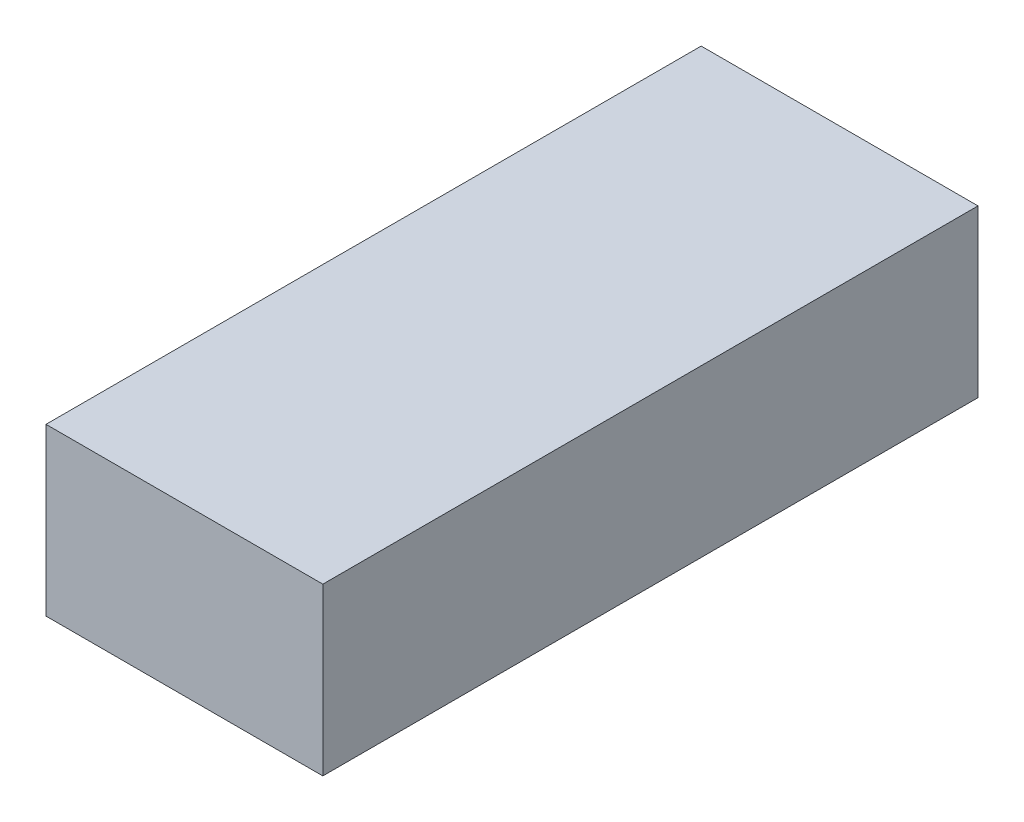
ISO-10303-21;
HEADER;
FILE_DESCRIPTION(('STEP AP214'),'2;1');
FILE_NAME('part.step','',(''),(''),'','','');
FILE_SCHEMA(('AUTOMOTIVE_DESIGN { 1 0 10303 214 1 1 1 1 }'));
ENDSEC;
DATA;
#1=APPLICATION_CONTEXT('core data for automotive mechanical design processes');
#2=APPLICATION_PROTOCOL_DEFINITION('international standard','automotive_design',2000,#1);
#3=PRODUCT_CONTEXT('',#1,'mechanical');
#4=PRODUCT('Part','Part','',(#3));
#5=PRODUCT_RELATED_PRODUCT_CATEGORY('part','',(#4));
#6=PRODUCT_DEFINITION_FORMATION('','',#4);
#7=PRODUCT_DEFINITION_CONTEXT('part definition',#1,'design');
#8=PRODUCT_DEFINITION('design','',#6,#7);
#9=PRODUCT_DEFINITION_SHAPE('','',#8);
#10=(LENGTH_UNIT() NAMED_UNIT(*) SI_UNIT(.MILLI.,.METRE.));
#11=(NAMED_UNIT(*) PLANE_ANGLE_UNIT() SI_UNIT($,.RADIAN.));
#12=(NAMED_UNIT(*) SI_UNIT($,.STERADIAN.) SOLID_ANGLE_UNIT());
#13=UNCERTAINTY_MEASURE_WITH_UNIT(LENGTH_MEASURE(1.E-05),#10,'distance_accuracy_value','');
#14=(GEOMETRIC_REPRESENTATION_CONTEXT(3) GLOBAL_UNCERTAINTY_ASSIGNED_CONTEXT((#13)) GLOBAL_UNIT_ASSIGNED_CONTEXT((#10,
#11,#12)) REPRESENTATION_CONTEXT('',''));
#15=CARTESIAN_POINT('',(0.,0.,0.));
#16=DIRECTION('',(0.,0.,1.));
#17=DIRECTION('',(1.,0.,0.));
#18=AXIS2_PLACEMENT_3D('',#15,#16,#17);
#19=CARTESIAN_POINT('',(15.,18.,-35.5));
#20=DIRECTION('',(-1.,0.,0.));
#21=DIRECTION('',(0.,0.,1.));
#22=AXIS2_PLACEMENT_3D('',#19,#20,#21);
#23=PLANE('',#22);
#24=DIRECTION('',(0.,0.,-1.));
#25=VECTOR('',#24,1.);
#26=CARTESIAN_POINT('',(15.,0.,-35.5));
#27=LINE('',#26,#25);
#28=CARTESIAN_POINT('',(15.,0.,35.5));
#29=VERTEX_POINT('',#28);
#30=CARTESIAN_POINT('',(15.,0.,-35.5));
#31=VERTEX_POINT('',#30);
#32=EDGE_CURVE('E106',#29,#31,#27,.T.);
#33=ORIENTED_EDGE('',*,*,#32,.T.);
#34=DIRECTION('',(0.,-1.,0.));
#35=VECTOR('',#34,1.);
#36=CARTESIAN_POINT('',(15.,18.,-35.5));
#37=LINE('',#36,#35);
#38=CARTESIAN_POINT('',(15.,18.,-35.5));
#39=VERTEX_POINT('',#38);
#40=EDGE_CURVE('E11',#39,#31,#37,.T.);
#41=ORIENTED_EDGE('',*,*,#40,.F.);
#42=DIRECTION('',(0.,0.,-1.));
#43=VECTOR('',#42,1.);
#44=CARTESIAN_POINT('',(15.,18.,-35.5));
#45=LINE('',#44,#43);
#46=CARTESIAN_POINT('',(15.,18.,35.5));
#47=VERTEX_POINT('',#46);
#48=EDGE_CURVE('E94',#47,#39,#45,.T.);
#49=ORIENTED_EDGE('',*,*,#48,.F.);
#50=DIRECTION('',(0.,-1.,0.));
#51=VECTOR('',#50,1.);
#52=CARTESIAN_POINT('',(15.,18.,35.5));
#53=LINE('',#52,#51);
#54=EDGE_CURVE('E105',#47,#29,#53,.T.);
#55=ORIENTED_EDGE('',*,*,#54,.T.);
#56=EDGE_LOOP('',(#33,#41,#49,#55));
#57=FACE_BOUND('',#56,.T.);
#58=ADVANCED_FACE('F43',(#57),#23,.F.);
#59=CARTESIAN_POINT('',(-15.,18.,-35.5));
#60=DIRECTION('',(0.,0.,1.));
#61=DIRECTION('',(1.,0.,0.));
#62=AXIS2_PLACEMENT_3D('',#59,#60,#61);
#63=PLANE('',#62);
#64=DIRECTION('',(-1.,0.,0.));
#65=VECTOR('',#64,1.);
#66=CARTESIAN_POINT('',(-15.,0.,-35.5));
#67=LINE('',#66,#65);
#68=CARTESIAN_POINT('',(-15.,0.,-35.5));
#69=VERTEX_POINT('',#68);
#70=EDGE_CURVE('E98',#31,#69,#67,.T.);
#71=ORIENTED_EDGE('',*,*,#70,.T.);
#72=DIRECTION('',(0.,-1.,0.));
#73=VECTOR('',#72,1.);
#74=CARTESIAN_POINT('',(-15.,18.,-35.5));
#75=LINE('',#74,#73);
#76=CARTESIAN_POINT('',(-15.,18.,-35.5));
#77=VERTEX_POINT('',#76);
#78=EDGE_CURVE('E51',#77,#69,#75,.T.);
#79=ORIENTED_EDGE('',*,*,#78,.F.);
#80=DIRECTION('',(-1.,0.,0.));
#81=VECTOR('',#80,1.);
#82=CARTESIAN_POINT('',(-15.,18.,-35.5));
#83=LINE('',#82,#81);
#84=EDGE_CURVE('E90',#39,#77,#83,.T.);
#85=ORIENTED_EDGE('',*,*,#84,.F.);
#86=ORIENTED_EDGE('',*,*,#40,.T.);
#87=EDGE_LOOP('',(#71,#79,#85,#86));
#88=FACE_BOUND('',#87,.T.);
#89=ADVANCED_FACE('F100',(#88),#63,.F.);
#90=CARTESIAN_POINT('',(-15.,18.,-35.5));
#91=DIRECTION('',(1.,0.,0.));
#92=DIRECTION('',(0.,0.,-1.));
#93=AXIS2_PLACEMENT_3D('',#90,#91,#92);
#94=PLANE('',#93);
#95=DIRECTION('',(0.,0.,1.));
#96=VECTOR('',#95,1.);
#97=CARTESIAN_POINT('',(-15.,0.,-35.5));
#98=LINE('',#97,#96);
#99=CARTESIAN_POINT('',(-15.,0.,35.5));
#100=VERTEX_POINT('',#99);
#101=EDGE_CURVE('E77',#69,#100,#98,.T.);
#102=ORIENTED_EDGE('',*,*,#101,.T.);
#103=DIRECTION('',(0.,-1.,0.));
#104=VECTOR('',#103,1.);
#105=CARTESIAN_POINT('',(-15.,18.,35.5));
#106=LINE('',#105,#104);
#107=CARTESIAN_POINT('',(-15.,18.,35.5));
#108=VERTEX_POINT('',#107);
#109=EDGE_CURVE('E97',#108,#100,#106,.T.);
#110=ORIENTED_EDGE('',*,*,#109,.F.);
#111=DIRECTION('',(0.,0.,1.));
#112=VECTOR('',#111,1.);
#113=CARTESIAN_POINT('',(-15.,18.,-35.5));
#114=LINE('',#113,#112);
#115=EDGE_CURVE('E95',#77,#108,#114,.T.);
#116=ORIENTED_EDGE('',*,*,#115,.F.);
#117=ORIENTED_EDGE('',*,*,#78,.T.);
#118=EDGE_LOOP('',(#102,#110,#116,#117));
#119=FACE_BOUND('',#118,.T.);
#120=ADVANCED_FACE('F99',(#119),#94,.F.);
#121=CARTESIAN_POINT('',(-15.,18.,35.5));
#122=DIRECTION('',(0.,0.,-1.));
#123=DIRECTION('',(-1.,0.,0.));
#124=AXIS2_PLACEMENT_3D('',#121,#122,#123);
#125=PLANE('',#124);
#126=DIRECTION('',(1.,0.,0.));
#127=VECTOR('',#126,1.);
#128=CARTESIAN_POINT('',(-15.,0.,35.5));
#129=LINE('',#128,#127);
#130=EDGE_CURVE('E85',#100,#29,#129,.T.);
#131=ORIENTED_EDGE('',*,*,#130,.T.);
#132=ORIENTED_EDGE('',*,*,#54,.F.);
#133=DIRECTION('',(1.,0.,0.));
#134=VECTOR('',#133,1.);
#135=CARTESIAN_POINT('',(-15.,18.,35.5));
#136=LINE('',#135,#134);
#137=EDGE_CURVE('E56',#108,#47,#136,.T.);
#138=ORIENTED_EDGE('',*,*,#137,.F.);
#139=ORIENTED_EDGE('',*,*,#109,.T.);
#140=EDGE_LOOP('',(#131,#132,#138,#139));
#141=FACE_BOUND('',#140,.T.);
#142=ADVANCED_FACE('F114',(#141),#125,.F.);
#143=CARTESIAN_POINT('',(0.,18.,0.));
#144=DIRECTION('',(0.,1.,0.));
#145=DIRECTION('',(0.,0.,1.));
#146=AXIS2_PLACEMENT_3D('',#143,#144,#145);
#147=PLANE('',#146);
#148=ORIENTED_EDGE('',*,*,#48,.T.);
#149=ORIENTED_EDGE('',*,*,#84,.T.);
#150=ORIENTED_EDGE('',*,*,#115,.T.);
#151=ORIENTED_EDGE('',*,*,#137,.T.);
#152=EDGE_LOOP('',(#148,#149,#150,#151));
#153=FACE_BOUND('',#152,.T.);
#154=ADVANCED_FACE('F89',(#153),#147,.T.);
#155=CARTESIAN_POINT('',(0.,0.,0.));
#156=DIRECTION('',(0.,1.,0.));
#157=DIRECTION('',(0.,0.,1.));
#158=AXIS2_PLACEMENT_3D('',#155,#156,#157);
#159=PLANE('',#158);
#160=ORIENTED_EDGE('',*,*,#32,.F.);
#161=ORIENTED_EDGE('',*,*,#130,.F.);
#162=ORIENTED_EDGE('',*,*,#101,.F.);
#163=ORIENTED_EDGE('',*,*,#70,.F.);
#164=EDGE_LOOP('',(#160,#161,#162,#163));
#165=FACE_BOUND('',#164,.T.);
#166=ADVANCED_FACE('F117',(#165),#159,.F.);
#167=CLOSED_SHELL('',(#58,#89,#120,#142,#154,#166));
#168=MANIFOLD_SOLID_BREP('B2',#167);
#169=ADVANCED_BREP_SHAPE_REPRESENTATION('',(#18,#168),#14);
#170=SHAPE_DEFINITION_REPRESENTATION(#9,#169);
ENDSEC;
END-ISO-10303-21;
